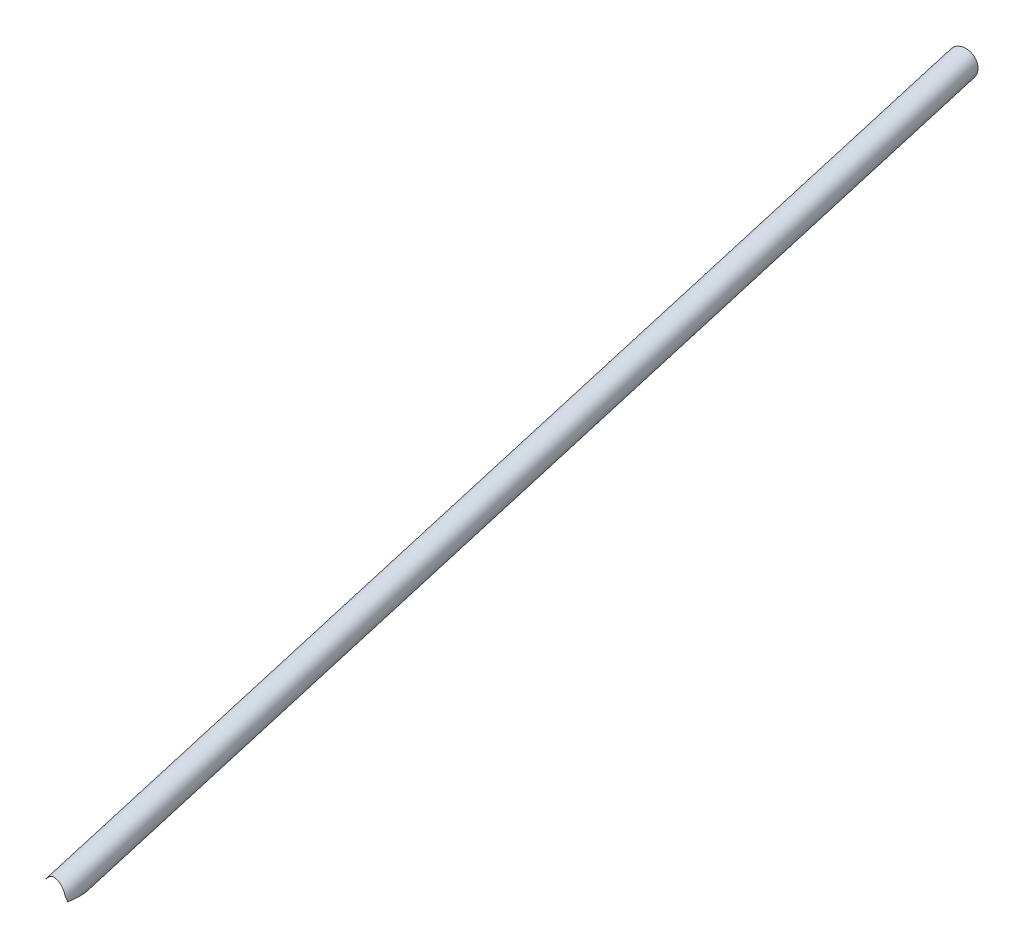
ISO-10303-21;
HEADER;
FILE_DESCRIPTION(('STEP AP214'),'2;1');
FILE_NAME('part.step','',(''),(''),'','','');
FILE_SCHEMA(('AUTOMOTIVE_DESIGN { 1 0 10303 214 1 1 1 1 }'));
ENDSEC;
DATA;
#1=APPLICATION_CONTEXT('core data for automotive mechanical design processes');
#2=APPLICATION_PROTOCOL_DEFINITION('international standard','automotive_design',2000,#1);
#3=PRODUCT_CONTEXT('',#1,'mechanical');
#4=PRODUCT('Part','Part','',(#3));
#5=PRODUCT_RELATED_PRODUCT_CATEGORY('part','',(#4));
#6=PRODUCT_DEFINITION_FORMATION('','',#4);
#7=PRODUCT_DEFINITION_CONTEXT('part definition',#1,'design');
#8=PRODUCT_DEFINITION('design','',#6,#7);
#9=PRODUCT_DEFINITION_SHAPE('','',#8);
#10=(LENGTH_UNIT() NAMED_UNIT(*) SI_UNIT(.MILLI.,.METRE.));
#11=(NAMED_UNIT(*) PLANE_ANGLE_UNIT() SI_UNIT($,.RADIAN.));
#12=(NAMED_UNIT(*) SI_UNIT($,.STERADIAN.) SOLID_ANGLE_UNIT());
#13=UNCERTAINTY_MEASURE_WITH_UNIT(LENGTH_MEASURE(1.E-05),#10,'distance_accuracy_value','');
#14=(GEOMETRIC_REPRESENTATION_CONTEXT(3) GLOBAL_UNCERTAINTY_ASSIGNED_CONTEXT((#13)) GLOBAL_UNIT_ASSIGNED_CONTEXT((#10,
#11,#12)) REPRESENTATION_CONTEXT('',''));
#15=CARTESIAN_POINT('',(0.,0.,0.));
#16=DIRECTION('',(0.,0.,1.));
#17=DIRECTION('',(1.,0.,0.));
#18=AXIS2_PLACEMENT_3D('',#15,#16,#17);
#19=CARTESIAN_POINT('',(-150.,500.,-1140.));
#20=DIRECTION('',(-0.0991899501072693,-0.396759800429077,0.912547540986877));
#21=DIRECTION('',(0.,-0.917070056253235,-0.39872611141445));
#22=AXIS2_PLACEMENT_3D('',#19,#20,#21);
#23=CYLINDRICAL_SURFACE('',#22,9.79999999999998);
#24=CARTESIAN_POINT('',(-150.,500.,-1140.));
#25=DIRECTION('',(-0.136924020573454,0.0230393226257372,-0.990313587810925));
#26=DIRECTION('',(-0.508281006832033,-0.859722512143853,0.0502754433782237));
#27=AXIS2_PLACEMENT_3D('',#24,#25,#26);
#28=ELLIPSE('',#27,10.89775457985,9.79999999999998);
#29=CARTESIAN_POINT('',(-155.539121670055,490.630955055884,-1139.45211055667));
#30=VERTEX_POINT('',#29);
#31=EDGE_CURVE('E103',#30,#30,#28,.T.);
#32=ORIENTED_EDGE('',*,*,#31,.T.);
#33=EDGE_LOOP('',(#32));
#34=FACE_BOUND('',#33,.T.);
#35=CARTESIAN_POINT('',(-220.0037526769,210.997702741119,-499.872991264384));
#36=CARTESIAN_POINT('',(-219.898541977434,210.83933172215,-499.508740659336));
#37=CARTESIAN_POINT('',(-219.797822306965,210.683385906516,-499.142129660316));
#38=CARTESIAN_POINT('',(-219.603918873193,210.375694236398,-498.405160474535));
#39=CARTESIAN_POINT('',(-219.510735682371,210.223948701549,-498.034802005509));
#40=CARTESIAN_POINT('',(-219.330804767801,209.924134834567,-497.290934981755));
#41=CARTESIAN_POINT('',(-219.244058699957,209.776067455086,-496.917425643818));
#42=CARTESIAN_POINT('',(-219.076189800758,209.48326963091,-496.167839782356));
#43=CARTESIAN_POINT('',(-218.995067131732,209.338539282624,-495.791763185067));
#44=CARTESIAN_POINT('',(-218.75895894337,208.90863598135,-494.659598100473));
#45=CARTESIAN_POINT('',(-218.611388850005,208.628013159537,-493.900229623437));
#46=CARTESIAN_POINT('',(-218.332013835661,208.077182915028,-492.374843704058));
#47=CARTESIAN_POINT('',(-218.200209786988,207.806976069189,-491.608825896333));
#48=CARTESIAN_POINT('',(-218.012075801151,207.408280938567,-490.454546374064));
#49=CARTESIAN_POINT('',(-217.95086852304,207.276276755357,-490.068281408356));
#50=CARTESIAN_POINT('',(-217.831464384232,207.014551797917,-489.294531384269));
#51=CARTESIAN_POINT('',(-217.773267408381,206.884830936469,-488.907046373164));
#52=CARTESIAN_POINT('',(-217.602803835464,206.498965771995,-487.742854714684));
#53=CARTESIAN_POINT('',(-217.494669606981,206.246129590103,-486.964442475506));
#54=CARTESIAN_POINT('',(-217.287828936704,205.749153504973,-485.404123514754));
#55=CARTESIAN_POINT('',(-217.18911700113,205.505008586913,-484.622219111202));
#56=CARTESIAN_POINT('',(-216.999696422368,205.025322653819,-483.054828887457));
#57=CARTESIAN_POINT('',(-216.908987636174,204.78978148509,-482.269343131521));
#58=CARTESIAN_POINT('',(-216.712489502068,204.26975776419,-480.497619596009));
#59=CARTESIAN_POINT('',(-216.608620944944,203.987810385815,-479.510423963666));
#60=CARTESIAN_POINT('',(-216.409355114824,203.439600545711,-477.530672991248));
#61=CARTESIAN_POINT('',(-216.31395901938,203.173340265991,-476.538116926421));
#62=CARTESIAN_POINT('',(-216.175630909405,202.788431802316,-475.045950974128));
#63=CARTESIAN_POINT('',(-216.13034938621,202.662635245507,-474.548396882427));
#64=CARTESIAN_POINT('',(-216.041038146166,202.416441376279,-473.551844740876));
#65=CARTESIAN_POINT('',(-215.997008415411,202.296044003872,-473.052846707135));
#66=CARTESIAN_POINT('',(-215.909872155996,202.06149581362,-472.053368215613));
#67=CARTESIAN_POINT('',(-215.866765510192,201.947344200256,-471.552887955222));
#68=CARTESIAN_POINT('',(-215.781094603804,201.726416168036,-470.550262226481));
#69=CARTESIAN_POINT('',(-215.738530331388,201.619639588038,-470.048116794765));
#70=CARTESIAN_POINT('',(-215.650428529746,201.407582320787,-469.005448483552));
#71=CARTESIAN_POINT('',(-215.604899578271,201.302973506736,-468.464787059967));
#72=CARTESIAN_POINT('',(-215.513365264216,201.106745651468,-467.381061835205));
#73=CARTESIAN_POINT('',(-215.467359841117,201.015128282607,-466.837997734));
#74=CARTESIAN_POINT('',(-215.37415119422,200.848785929421,-465.748745415167));
#75=CARTESIAN_POINT('',(-215.326946806406,200.77407811791,-465.202554594021));
#76=CARTESIAN_POINT('',(-215.2547857882,200.679403455488,-464.381433318247));
#77=CARTESIAN_POINT('',(-215.230508633869,200.650744883853,-464.107445258742));
#78=CARTESIAN_POINT('',(-215.181439281758,200.600309499969,-463.558889114116));
#79=CARTESIAN_POINT('',(-215.156647111881,200.57853231591,-463.28432106114));
#80=CARTESIAN_POINT('',(-215.100426615081,200.53885347249,-462.667972170555));
#81=CARTESIAN_POINT('',(-215.068848267619,200.523175777996,-462.326054620453));
#82=CARTESIAN_POINT('',(-215.004924025603,200.507662753279,-461.641956865593));
#83=CARTESIAN_POINT('',(-214.972578317376,200.507823615818,-461.299776743728));
#84=CARTESIAN_POINT('',(-214.907544676726,200.528179233874,-460.616449264774));
#85=CARTESIAN_POINT('',(-214.874857284927,200.548346029101,-460.27530113282));
#86=CARTESIAN_POINT('',(-214.81005741036,200.613999431036,-459.595377249243));
#87=CARTESIAN_POINT('',(-214.7779446224,200.659472158429,-459.256600300161));
#88=CARTESIAN_POINT('',(-214.727071530788,200.760571780086,-458.701801429869));
#89=CARTESIAN_POINT('',(-214.707562303326,200.807117524649,-458.484197905931));
#90=CARTESIAN_POINT('',(-214.670565152225,200.915307841983,-458.05263088851));
#91=CARTESIAN_POINT('',(-214.653076462255,200.976946662548,-457.838666041418));
#92=CARTESIAN_POINT('',(-214.621365610673,201.11669597458,-457.416333187158));
#93=CARTESIAN_POINT('',(-214.607137357502,201.194775217274,-457.207955395758));
#94=CARTESIAN_POINT('',(-214.58345522324,201.368405637347,-456.798291988106));
#95=CARTESIAN_POINT('',(-214.574001059559,201.463955780124,-456.597005952732));
#96=CARTESIAN_POINT('',(-214.561589632928,201.673665076132,-456.201472785184));
#97=CARTESIAN_POINT('',(-214.558699908899,201.788004814546,-456.007318869976));
#98=CARTESIAN_POINT('',(-214.561524930687,202.03356840442,-455.630047733012));
#99=CARTESIAN_POINT('',(-214.567239849397,202.164792595088,-455.446930733097));
#100=CARTESIAN_POINT('',(-214.589038425511,202.442248108915,-455.092800052293));
#101=CARTESIAN_POINT('',(-214.605133302664,202.588495526774,-454.921799690582));
#102=CARTESIAN_POINT('',(-214.649131281722,202.893178122741,-454.592685665046));
#103=CARTESIAN_POINT('',(-214.677034448436,203.051613367741,-454.434572071958));
#104=CARTESIAN_POINT('',(-214.741696873717,203.358852109674,-454.148701514513));
#105=CARTESIAN_POINT('',(-214.777062600126,203.506657294005,-454.019546998449));
#106=CARTESIAN_POINT('',(-214.858266387495,203.807427209433,-453.770954805609));
#107=CARTESIAN_POINT('',(-214.904103287638,203.960391367015,-453.651516053749));
#108=CARTESIAN_POINT('',(-215.006502909779,204.269621983415,-453.421848052287));
#109=CARTESIAN_POINT('',(-215.063067064095,204.425888880742,-453.31162003535));
#110=CARTESIAN_POINT('',(-215.187000218061,204.740017747765,-453.099836371536));
#111=CARTESIAN_POINT('',(-215.254370585218,204.897879916968,-452.998281824767));
#112=CARTESIAN_POINT('',(-215.410973468012,205.237778930944,-452.788434445977));
#113=CARTESIAN_POINT('',(-215.501973311572,205.419828702529,-452.681478258533));
#114=CARTESIAN_POINT('',(-215.698021057617,205.781989035189,-452.477638743009));
#115=CARTESIAN_POINT('',(-215.803069944461,205.962099459425,-452.38075612159));
#116=CARTESIAN_POINT('',(-216.026874456738,206.318688506442,-452.196401839405));
#117=CARTESIAN_POINT('',(-216.145635189476,206.49516574693,-452.108933708882));
#118=CARTESIAN_POINT('',(-216.396341051081,206.842890826029,-451.9429450064));
#119=CARTESIAN_POINT('',(-216.528287079579,207.014138306773,-451.864425045755));
#120=CARTESIAN_POINT('',(-216.823287871307,207.372537749894,-451.706016630946));
#121=CARTESIAN_POINT('',(-216.988142842892,207.558752094642,-451.627350698705));
#122=CARTESIAN_POINT('',(-217.333077101251,207.921006095912,-451.480655832299));
#123=CARTESIAN_POINT('',(-217.513157653607,208.097044904572,-451.41262778372));
#124=CARTESIAN_POINT('',(-217.887489216179,208.437499419234,-451.286983323167));
#125=CARTESIAN_POINT('',(-218.081744245318,208.601911802546,-451.229369880297));
#126=CARTESIAN_POINT('',(-218.483163424881,208.917767107984,-451.124512507122));
#127=CARTESIAN_POINT('',(-218.690327619436,209.069209985768,-451.077268612269));
#128=CARTESIAN_POINT('',(-219.125159273858,209.364066538698,-450.991455288807));
#129=CARTESIAN_POINT('',(-219.35332173178,209.506880458773,-450.953330710893));
#130=CARTESIAN_POINT('',(-219.820643641494,209.776211513944,-450.8886138399));
#131=CARTESIAN_POINT('',(-220.059803474357,209.902728083739,-450.862021946776));
#132=CARTESIAN_POINT('',(-220.547411495375,210.138647935161,-450.820723289283));
#133=CARTESIAN_POINT('',(-220.795859678403,210.248051226234,-450.806016518353));
#134=CARTESIAN_POINT('',(-221.300232237199,210.449155251392,-450.788985464775));
#135=CARTESIAN_POINT('',(-221.556156568962,210.540856089649,-450.786661109259));
#136=CARTESIAN_POINT('',(-222.074701477308,210.706571175633,-450.795069982975));
#137=CARTESIAN_POINT('',(-222.337346502075,210.780506078992,-450.805860532392));
#138=CARTESIAN_POINT('',(-222.866186233639,210.91008358533,-450.841445984494));
#139=CARTESIAN_POINT('',(-223.132380996319,210.965725899977,-450.866241107905));
#140=CARTESIAN_POINT('',(-223.666287945453,211.058968199897,-450.930920928675));
#141=CARTESIAN_POINT('',(-223.934001022146,211.096556179992,-450.970815635026));
#142=CARTESIAN_POINT('',(-224.468377251314,211.154214150952,-451.067001026808));
#143=CARTESIAN_POINT('',(-224.735040426954,211.174284530519,-451.123291348396));
#144=CARTESIAN_POINT('',(-225.259260727881,211.197684754343,-451.252492946122));
#145=CARTESIAN_POINT('',(-225.516892435512,211.201349575265,-451.325039562838));
#146=CARTESIAN_POINT('',(-226.025905243115,211.194311353536,-451.489054791647));
#147=CARTESIAN_POINT('',(-226.277286170338,211.183607914248,-451.580523926038));
#148=CARTESIAN_POINT('',(-226.770257050517,211.149934552156,-451.783983272675));
#149=CARTESIAN_POINT('',(-227.011864016665,211.126987026264,-451.895935771791));
#150=CARTESIAN_POINT('',(-227.482333899541,211.071610045153,-452.14209527429));
#151=CARTESIAN_POINT('',(-227.711199661572,211.039182717111,-452.276297282173));
#152=CARTESIAN_POINT('',(-228.126972263523,210.972457623113,-452.551030458013));
#153=CARTESIAN_POINT('',(-228.315665333328,210.938814337702,-452.689016964331));
#154=CARTESIAN_POINT('',(-228.677945944206,210.869610277575,-452.983131112375));
#155=CARTESIAN_POINT('',(-228.851536340987,210.83404986743,-453.139255311418));
#156=CARTESIAN_POINT('',(-229.181523710596,210.763860948942,-453.468453691624));
#157=CARTESIAN_POINT('',(-229.337945054015,210.729231173789,-453.641503170238));
#158=CARTESIAN_POINT('',(-229.632869838212,210.663331258692,-454.002830736472));
#159=CARTESIAN_POINT('',(-229.771371616703,210.632061430475,-454.191110234257));
#160=CARTESIAN_POINT('',(-230.037057004416,210.573278552184,-454.590224589374));
#161=CARTESIAN_POINT('',(-230.163305150012,210.546037882926,-454.8017197896));
#162=CARTESIAN_POINT('',(-230.397165668695,210.498542655979,-455.235470806513));
#163=CARTESIAN_POINT('',(-230.504775122009,210.478289192352,-455.45772830216));
#164=CARTESIAN_POINT('',(-230.703534245723,210.445092664141,-455.910688453243));
#165=CARTESIAN_POINT('',(-230.794636498104,210.432170439319,-456.141413217917));
#166=CARTESIAN_POINT('',(-230.9622265321,210.413490446598,-456.608310251851));
#167=CARTESIAN_POINT('',(-231.038714914962,210.407732383897,-456.844482296552));
#168=CARTESIAN_POINT('',(-231.200042386977,210.402083011359,-457.390782723299));
#169=CARTESIAN_POINT('',(-231.280682327612,210.404425051732,-457.702164317566));
#170=CARTESIAN_POINT('',(-231.425381645654,210.418614244467,-458.328605523965));
#171=CARTESIAN_POINT('',(-231.489432050429,210.430466526407,-458.643667030548));
#172=CARTESIAN_POINT('',(-231.604385230104,210.462152195899,-459.276382232837));
#173=CARTESIAN_POINT('',(-231.655261526537,210.482001455047,-459.594039845412));
#174=CARTESIAN_POINT('',(-231.746314780964,210.528290489007,-460.230312019371));
#175=CARTESIAN_POINT('',(-231.786493630507,210.554729097073,-460.548926401487));
#176=CARTESIAN_POINT('',(-231.858478854799,210.613282145645,-461.18937646374));
#177=CARTESIAN_POINT('',(-231.890209676845,210.645443775548,-461.511216137065));
#178=CARTESIAN_POINT('',(-231.946404783734,210.714297605412,-462.155041353136));
#179=CARTESIAN_POINT('',(-231.970868827305,210.750989955744,-462.477026900369));
#180=CARTESIAN_POINT('',(-232.013697130245,210.828044286263,-463.120506455635));
#181=CARTESIAN_POINT('',(-232.032069692181,210.868401175327,-463.442000533273));
#182=CARTESIAN_POINT('',(-232.063678203373,210.952169617679,-464.08482645134));
#183=CARTESIAN_POINT('',(-232.076914313486,210.995581075257,-464.406158296536));
#184=CARTESIAN_POINT('',(-232.100279790145,211.090233358092,-465.086836107085));
#185=CARTESIAN_POINT('',(-232.109852239054,211.141791216956,-465.446156733193));
#186=CARTESIAN_POINT('',(-232.124233831614,211.247443950452,-466.164522695637));
#187=CARTESIAN_POINT('',(-232.129042864222,211.301538884197,-466.52356802536));
#188=CARTESIAN_POINT('',(-232.137250580971,211.466865138228,-467.600357577464));
#189=CARTESIAN_POINT('',(-232.134427747317,211.581128018665,-468.31768572416));
#190=CARTESIAN_POINT('',(-232.115494159042,211.8147442572,-469.751625281926));
#191=CARTESIAN_POINT('',(-232.099377574059,211.934099827061,-470.468236240357));
#192=CARTESIAN_POINT('',(-232.055820505066,212.175750332153,-471.900626537555));
#193=CARTESIAN_POINT('',(-232.028379783725,212.298045328937,-472.616405858577));
#194=CARTESIAN_POINT('',(-231.963297546459,212.544371522659,-474.049479380964));
#195=CARTESIAN_POINT('',(-231.925624741522,212.668406919757,-474.766771420107));
#196=CARTESIAN_POINT('',(-231.840825902121,212.916598853625,-476.200782829872));
#197=CARTESIAN_POINT('',(-231.793699748447,213.040755391902,-476.917502193157));
#198=CARTESIAN_POINT('',(-231.690354009519,213.288110554682,-478.350176302893));
#199=CARTESIAN_POINT('',(-231.634137785451,213.411309515681,-479.066131233881));
#200=CARTESIAN_POINT('',(-231.512648950929,213.655886560805,-480.497580279977));
#201=CARTESIAN_POINT('',(-231.447376394702,213.777264655828,-481.21307439782));
#202=CARTESIAN_POINT('',(-231.30807569797,214.016475285748,-482.63843319418));
#203=CARTESIAN_POINT('',(-231.234114333517,214.13432712155,-483.34830114281));
#204=CARTESIAN_POINT('',(-231.076619775329,214.366546864893,-484.767555696608));
#205=CARTESIAN_POINT('',(-230.993086493104,214.480914740213,-485.476942297266));
#206=CARTESIAN_POINT('',(-230.815689643579,214.705314540271,-486.895533861273));
#207=CARTESIAN_POINT('',(-230.721820251849,214.815343972368,-487.604738494149));
#208=CARTESIAN_POINT('',(-230.52275784438,215.029940419548,-489.022375061863));
#209=CARTESIAN_POINT('',(-230.417565112561,215.134507571493,-489.730807015624));
#210=CARTESIAN_POINT('',(-230.194788512269,215.33653324915,-491.144121942385));
#211=CARTESIAN_POINT('',(-230.077249996464,215.434015711303,-491.849008581912));
#212=CARTESIAN_POINT('',(-229.827423627649,215.620609944659,-493.257254991623));
#213=CARTESIAN_POINT('',(-229.695136501489,215.709722127974,-493.960614835311));
#214=CARTESIAN_POINT('',(-229.412968191604,215.877242982556,-495.364525164764));
#215=CARTESIAN_POINT('',(-229.26310193355,215.95566061348,-496.065077518963));
#216=CARTESIAN_POINT('',(-229.02162469425,216.062720792209,-497.113056610122));
#217=CARTESIAN_POINT('',(-228.938361671076,216.096643649656,-497.46187381293));
#218=CARTESIAN_POINT('',(-228.765438139836,216.160346303889,-498.158293354028));
#219=CARTESIAN_POINT('',(-228.675778005302,216.190126342279,-498.505895762011));
#220=CARTESIAN_POINT('',(-228.535761298941,216.231078283448,-499.025863493769));
#221=CARTESIAN_POINT('',(-228.488199719857,216.244102198706,-499.198838097205));
#222=CARTESIAN_POINT('',(-228.391048157127,216.268791607211,-499.544318006423));
#223=CARTESIAN_POINT('',(-228.341458121406,216.280457065552,-499.716823300035));
#224=CARTESIAN_POINT('',(-228.189343935872,216.313216603435,-500.233622150125));
#225=CARTESIAN_POINT('',(-228.083502380677,216.332065828572,-500.577098771919));
#226=CARTESIAN_POINT('',(-227.86139252782,216.362246606318,-501.259873477635));
#227=CARTESIAN_POINT('',(-227.745156701867,216.37360070218,-501.599181051447));
#228=CARTESIAN_POINT('',(-227.499284555795,216.386726897463,-502.27304442494));
#229=CARTESIAN_POINT('',(-227.369653858241,216.388503000776,-502.607602151857));
#230=CARTESIAN_POINT('',(-227.119006734499,216.37995830622,-503.206537132011));
#231=CARTESIAN_POINT('',(-227.001011876305,216.371865781095,-503.472201068109));
#232=CARTESIAN_POINT('',(-226.749570166614,216.344230598519,-503.996922802397));
#233=CARTESIAN_POINT('',(-226.6160706634,216.324647952916,-504.255954215937));
#234=CARTESIAN_POINT('',(-226.399738457707,216.282922606971,-504.636072191996));
#235=CARTESIAN_POINT('',(-226.32444673946,216.266821205251,-504.762102576402));
#236=CARTESIAN_POINT('',(-226.167626872576,216.229494890221,-505.009601371631));
#237=CARTESIAN_POINT('',(-226.086095101298,216.208266985088,-505.131067070495));
#238=CARTESIAN_POINT('',(-225.916159748721,216.159628137315,-505.366876536654));
#239=CARTESIAN_POINT('',(-225.827794655418,216.132250376455,-505.481254470013));
#240=CARTESIAN_POINT('',(-225.642659657127,216.069744988734,-505.700593790161));
#241=CARTESIAN_POINT('',(-225.545903759015,216.03463013205,-505.805570297188));
#242=CARTESIAN_POINT('',(-225.359859813046,215.96149699191,-505.985313809904));
#243=CARTESIAN_POINT('',(-225.272056422965,215.924962505646,-506.062191443413));
#244=CARTESIAN_POINT('',(-225.08957868822,215.844162948706,-506.202798126629));
#245=CARTESIAN_POINT('',(-224.994907130301,215.799901003292,-506.266532469314));
#246=CARTESIAN_POINT('',(-224.798302833459,215.70241331437,-506.376999432064));
#247=CARTESIAN_POINT('',(-224.696294688426,215.64908334687,-506.423511717696));
#248=CARTESIAN_POINT('',(-224.488970061183,215.534528759077,-506.493824091893));
#249=CARTESIAN_POINT('',(-224.383659013719,215.473316640886,-506.517659656903));
#250=CARTESIAN_POINT('',(-224.185910894186,215.352556245407,-506.53955799833));
#251=CARTESIAN_POINT('',(-224.093379687609,215.293619174768,-506.540257969669));
#252=CARTESIAN_POINT('',(-223.911577883151,215.173268283006,-506.523741806032));
#253=CARTESIAN_POINT('',(-223.822310895209,215.111851868942,-506.506506421545));
#254=CARTESIAN_POINT('',(-223.615967973326,214.964989545821,-506.44741694347));
#255=CARTESIAN_POINT('',(-223.501117801783,214.879226156302,-506.398724693955));
#256=CARTESIAN_POINT('',(-223.281822723414,214.709006024823,-506.280315766423));
#257=CARTESIAN_POINT('',(-223.177404294864,214.624553045596,-506.210547310091));
#258=CARTESIAN_POINT('',(-222.986110895228,214.464668088425,-506.062365010378));
#259=CARTESIAN_POINT('',(-222.898501552761,214.389050998633,-505.98507174059));
#260=CARTESIAN_POINT('',(-222.730305176273,214.239963180661,-505.821229234793));
#261=CARTESIAN_POINT('',(-222.649724764889,214.166494519127,-505.734671437151));
#262=CARTESIAN_POINT('',(-222.494405031075,214.02149090629,-505.554419714279));
#263=CARTESIAN_POINT('',(-222.419683187041,213.94996212885,-505.460705967903));
#264=CARTESIAN_POINT('',(-222.275473867362,213.808927981042,-505.2680107642));
#265=CARTESIAN_POINT('',(-222.205984195118,213.739421769152,-505.169031547571));
#266=CARTESIAN_POINT('',(-222.026473494486,213.556348360857,-504.899370961096));
#267=CARTESIAN_POINT('',(-221.920403177731,213.444380278478,-504.724979938697));
#268=CARTESIAN_POINT('',(-221.717944793574,213.224628112617,-504.36807325296));
#269=CARTESIAN_POINT('',(-221.621562593557,213.116846588582,-504.185552761602));
#270=CARTESIAN_POINT('',(-221.436505323574,212.904674779575,-503.814208847658));
#271=CARTESIAN_POINT('',(-221.347845299672,212.800291352745,-503.625374070493));
#272=CARTESIAN_POINT('',(-221.177055568364,212.594603060266,-503.243110224738));
#273=CARTESIAN_POINT('',(-221.094926974234,212.493298721253,-503.04968038019));
#274=CARTESIAN_POINT('',(-220.936052363223,212.293207868386,-502.658884755063));
#275=CARTESIAN_POINT('',(-220.859315684584,212.194425902589,-502.46151287108));
#276=CARTESIAN_POINT('',(-220.710586953133,211.999228865273,-502.063826833434));
#277=CARTESIAN_POINT('',(-220.638595258202,211.902813972629,-501.863512459229));
#278=CARTESIAN_POINT('',(-220.428929569767,211.616923043414,-501.259391180244));
#279=CARTESIAN_POINT('',(-220.297387652452,211.430574844236,-500.851959783799));
#280=CARTESIAN_POINT('',(-220.143494191009,211.205617735645,-500.346748653704));
#281=CARTESIAN_POINT('',(-220.115079842885,211.163769087755,-500.252180055558));
#282=CARTESIAN_POINT('',(-220.058926532434,211.080459804676,-500.06279132674));
#283=CARTESIAN_POINT('',(-220.031186924664,211.038998824075,-499.967971541082));
#284=CARTESIAN_POINT('',(-220.0037526769,210.997702741119,-499.872991264384));
#285=B_SPLINE_CURVE_WITH_KNOTS('',3,(#35,#36,#37,#38,#39,#40,#41,#42,#43,#44,#45,#46,#47,#48,
#49,#50,#51,#52,#53,#54,#55,#56,#57,#58,#59,#60,#61,#62,#63,#64,#65,#66,#67,#68,#69,#70,#71,#72,
#73,#74,#75,#76,#77,#78,#79,#80,#81,#82,#83,#84,#85,#86,#87,#88,#89,#90,#91,#92,#93,#94,#95,#96,
#97,#98,#99,#100,#101,#102,#103,#104,#105,#106,#107,#108,#109,#110,#111,#112,#113,#114,#115,
#116,#117,#118,#119,#120,#121,#122,#123,#124,#125,#126,#127,#128,#129,#130,#131,#132,#133,#134,
#135,#136,#137,#138,#139,#140,#141,#142,#143,#144,#145,#146,#147,#148,#149,#150,#151,#152,#153,
#154,#155,#156,#157,#158,#159,#160,#161,#162,#163,#164,#165,#166,#167,#168,#169,#170,#171,#172,
#173,#174,#175,#176,#177,#178,#179,#180,#181,#182,#183,#184,#185,#186,#187,#188,#189,#190,#191,
#192,#193,#194,#195,#196,#197,#198,#199,#200,#201,#202,#203,#204,#205,#206,#207,#208,#209,#210,
#211,#212,#213,#214,#215,#216,#217,#218,#219,#220,#221,#222,#223,#224,#225,#226,#227,#228,#229,
#230,#231,#232,#233,#234,#235,#236,#237,#238,#239,#240,#241,#242,#243,#244,#245,#246,#247,#248,
#249,#250,#251,#252,#253,#254,#255,#256,#257,#258,#259,#260,#261,#262,#263,#264,#265,#266,#267,
#268,#269,#270,#271,#272,#273,#274,#275,#276,#277,#278,#279,#280,#281,#282,#283,#284),
.UNSPECIFIED.,.T.,.F.,(4,2,2,2,2,2,2,2,2,2,2,2,2,2,2,2,2,2,2,2,2,2,2,2,2,2,2,2,2,2,2,2,2,2,2,2,
2,2,2,2,2,2,2,2,2,2,2,2,2,2,2,2,2,2,2,2,2,2,2,2,2,2,2,2,2,2,2,2,2,2,2,2,2,2,2,2,2,2,2,2,2,2,2,2,
2,2,2,2,2,2,2,2,2,2,2,2,2,2,2,2,2,2,2,2,2,2,2,2,2,2,2,2,2,2,2,2,2,2,2,2,2,2,2,2,4),(0.,
1.23265464315552,2.46540283257261,3.6984670460467,4.93156683890578,7.39993393767297,
9.86843754353147,11.1067054894791,12.3449260324296,14.8214667248068,17.296554505456,
19.7715980504053,22.8671672466259,25.9631660117774,27.5087531800353,29.0543231718507,
30.5996958449188,32.1450347416803,33.8026086556646,35.4603957515296,37.1198589641673,
37.9494404649946,38.7789771347735,39.8098783694467,40.8405317989104,41.8697468137174,
42.8983978998184,43.5680811424742,44.237509554636,44.9056768694551,45.5738046291652,
46.2487759460415,46.9237608251964,47.5994765243769,48.2751959323347,48.8729396080117,
49.4706170510225,50.0683743530265,50.6662073599193,51.355270436594,52.0443818184306,
52.7337507093664,53.4231666679984,54.2048239363326,54.9865462415962,55.7684910580783,
56.5504385478293,57.3650535763004,58.1796968534331,58.9943396808317,59.808977714195,
60.6271890554228,61.4454132927815,62.2641808553215,63.0829302496056,63.8848834368959,
64.6868587626165,65.4873721171664,66.2877059818324,66.995101679387,67.7023633260793,
68.4086077015381,69.1149175440354,69.857193478514,70.5995855864008,71.3440775765591,
72.0885389301063,73.0527419497849,74.0174653853181,74.9841130139326,75.9505896039881,
76.9254394872414,77.9003217337692,78.8738697198426,79.847387214998,80.9367188413948,
82.0260758613617,84.2050009429758,86.3848821640317,88.5648090730189,90.7514785978745,
92.9381756995186,95.1240660795061,97.3099433715225,99.4800029812262,101.650082654067,
103.821391493228,105.992645902095,108.156186004803,110.319619529632,112.481229295717,
113.561821099171,114.642349857505,115.181933926688,115.721531857289,116.801038746713,
117.877283805648,118.953078926475,119.8250400381,120.700053918388,121.142900374556,
121.586005902758,122.026775738439,122.46682345587,122.832795422163,123.198619717656,
123.568974589575,123.938749104867,124.26620808432,124.594018879103,125.045599244032,
125.498298163929,125.915184102957,126.332458680904,126.75093419516,127.1692330316,
127.867096958692,128.565381016273,129.264996533679,129.964731045354,130.665648988299,
131.366619736184,132.766970498888,133.088712680428,133.41013391476),.UNSPECIFIED.);
#286=CARTESIAN_POINT('',(-227.66057539334,211.045111244531,-452.251060542697));
#287=VERTEX_POINT('',#286);
#288=CARTESIAN_POINT('',(-215.417930816631,200.926928641914,-466.260367661846));
#289=VERTEX_POINT('',#288);
#290=EDGE_CURVE('E98',#287,#289,#285,.T.);
#291=ORIENTED_EDGE('',*,*,#290,.T.);
#292=CARTESIAN_POINT('',(-222.839154654504,199.656094830705,-473.787293070432));
#293=CARTESIAN_POINT('',(-222.688053234654,199.66665120872,-473.81157494525));
#294=CARTESIAN_POINT('',(-222.53589017786,199.677848045147,-473.828934059664));
#295=CARTESIAN_POINT('',(-222.230682760392,199.7014880811,-473.848789976039));
#296=CARTESIAN_POINT('',(-222.077638548268,199.713931076024,-473.851289213725));
#297=CARTESIAN_POINT('',(-221.772326770698,199.739967995226,-473.840794230393));
#298=CARTESIAN_POINT('',(-221.620058569954,199.753560726661,-473.827815888434));
#299=CARTESIAN_POINT('',(-221.317752598665,199.781780429542,-473.786281904019));
#300=CARTESIAN_POINT('',(-221.167714883852,199.796407426778,-473.757725873006));
#301=CARTESIAN_POINT('',(-220.871729819852,199.826502842202,-473.685562630919));
#302=CARTESIAN_POINT('',(-220.725774761255,199.84196948575,-473.641986197146));
#303=CARTESIAN_POINT('',(-220.438949150531,199.873595740319,-473.540716452023));
#304=CARTESIAN_POINT('',(-220.29807869192,199.889755364074,-473.483022881182));
#305=CARTESIAN_POINT('',(-220.02220104299,199.922620651635,-473.354711584157));
#306=CARTESIAN_POINT('',(-219.887202201708,199.939327037357,-473.284076154047));
#307=CARTESIAN_POINT('',(-219.623841999576,199.97311751767,-473.131386615392));
#308=CARTESIAN_POINT('',(-219.495484837519,199.990201841681,-473.049325401705));
#309=CARTESIAN_POINT('',(-219.055917280597,200.050783959874,-472.742923048558));
#310=CARTESIAN_POINT('',(-218.763101249845,200.094986313544,-472.491794303484));
#311=CARTESIAN_POINT('',(-218.356661869154,200.161442489946,-472.083875035255));
#312=CARTESIAN_POINT('',(-218.226514729672,200.18364575405,-471.942515982277));
#313=CARTESIAN_POINT('',(-217.976274044781,200.228073447553,-471.651106550468));
#314=CARTESIAN_POINT('',(-217.856179605413,200.250297874891,-471.501056946477));
#315=CARTESIAN_POINT('',(-217.540003505004,200.311159911571,-471.080299226768));
#316=CARTESIAN_POINT('',(-217.35343415082,200.349776558039,-470.802450181925));
#317=CARTESIAN_POINT('',(-217.004946050582,200.426938092842,-470.231650328305));
#318=CARTESIAN_POINT('',(-216.84304661536,200.465482901871,-469.93868792693));
#319=CARTESIAN_POINT('',(-216.540329787548,200.542707287572,-469.341141365165));
#320=CARTESIAN_POINT('',(-216.399571976762,200.581386942005,-469.036527286624));
#321=CARTESIAN_POINT('',(-216.136981068397,200.658959148351,-468.419437979941));
#322=CARTESIAN_POINT('',(-216.015143439987,200.697851646976,-468.106964654751));
#323=CARTESIAN_POINT('',(-215.786046533799,200.776830458293,-467.470312800744));
#324=CARTESIAN_POINT('',(-215.679096992713,200.816925566653,-467.146024684544));
#325=CARTESIAN_POINT('',(-215.480594783948,200.897932727694,-466.492829194018));
#326=CARTESIAN_POINT('',(-215.389045312552,200.938844947999,-466.163920876081));
#327=CARTESIAN_POINT('',(-215.219794255664,201.021901002604,-465.502382672916));
#328=CARTESIAN_POINT('',(-215.142106489437,201.064046017754,-465.169749421295));
#329=CARTESIAN_POINT('',(-214.999510607978,201.149989536995,-464.50200683687));
#330=CARTESIAN_POINT('',(-214.934601571035,201.193787921558,-464.166897684461));
#331=CARTESIAN_POINT('',(-214.816635223532,201.283611986279,-463.494927797963));
#332=CARTESIAN_POINT('',(-214.763577171825,201.329637526933,-463.158067174759));
#333=CARTESIAN_POINT('',(-214.668608232124,201.424646170894,-462.483182406028));
#334=CARTESIAN_POINT('',(-214.626697847062,201.473629407516,-462.145158208701));
#335=CARTESIAN_POINT('',(-214.553570756425,201.57545397145,-461.468796573997));
#336=CARTESIAN_POINT('',(-214.522346095086,201.628292392774,-461.130459558535));
#337=CARTESIAN_POINT('',(-214.470284128398,201.739095183514,-460.453852125001));
#338=CARTESIAN_POINT('',(-214.449445782066,201.797059038541,-460.115581703653));
#339=CARTESIAN_POINT('',(-214.42001980113,201.912449854993,-459.480308218855));
#340=CARTESIAN_POINT('',(-214.410262881506,201.969107906601,-459.183220161456));
#341=CARTESIAN_POINT('',(-214.398983909241,202.089280686453,-458.590234432574));
#342=CARTESIAN_POINT('',(-214.397462432459,202.152795893863,-458.29433684578));
#343=CARTESIAN_POINT('',(-214.403117627635,202.288779011453,-457.704716904437));
#344=CARTESIAN_POINT('',(-214.410292806426,202.36124538285,-457.410994185186));
#345=CARTESIAN_POINT('',(-214.434172825972,202.518000554634,-456.827100484378));
#346=CARTESIAN_POINT('',(-214.450875332508,202.602286455393,-456.536928650626));
#347=CARTESIAN_POINT('',(-214.488604178815,202.759109475122,-456.048142153458));
#348=CARTESIAN_POINT('',(-214.506854093141,202.82765020434,-455.848038533289));
#349=CARTESIAN_POINT('',(-214.549467706695,202.974221902276,-455.45191509897));
#350=CARTESIAN_POINT('',(-214.573832234622,203.052254156618,-455.255895842266));
#351=CARTESIAN_POINT('',(-214.629550787261,203.219552592542,-454.870201852566));
#352=CARTESIAN_POINT('',(-214.66088893515,203.308793058506,-454.680513815881));
#353=CARTESIAN_POINT('',(-214.731755255968,203.500636657678,-454.309596637649));
#354=CARTESIAN_POINT('',(-214.771279120733,203.603232751275,-454.1283631077));
#355=CARTESIAN_POINT('',(-214.846910824206,203.791246511631,-453.828853205442));
#356=CARTESIAN_POINT('',(-214.880648880853,203.872938395459,-453.707640150533));
#357=CARTESIAN_POINT('',(-214.95335074942,204.044067289575,-453.472485719704));
#358=CARTESIAN_POINT('',(-214.992312752683,204.133501615462,-453.358541847079));
#359=CARTESIAN_POINT('',(-215.075788906288,204.319847373062,-453.139420087949));
#360=CARTESIAN_POINT('',(-215.120294295329,204.416746915825,-453.034228796191));
#361=CARTESIAN_POINT('',(-215.215156283059,204.617514974946,-452.833570176845));
#362=CARTESIAN_POINT('',(-215.265512863338,204.721383469376,-452.738102818665));
#363=CARTESIAN_POINT('',(-215.372214063103,204.935104614363,-452.557565100836));
#364=CARTESIAN_POINT('',(-215.428564277366,205.044962808576,-452.47250461759));
#365=CARTESIAN_POINT('',(-215.547148140985,205.269181401608,-452.313120449503));
#366=CARTESIAN_POINT('',(-215.609381954995,205.383541926375,-452.23879706529));
#367=CARTESIAN_POINT('',(-215.73969277045,205.615504737041,-452.10047628856));
#368=CARTESIAN_POINT('',(-215.807781420694,205.733113154097,-452.036500246959));
#369=CARTESIAN_POINT('',(-215.949481566353,205.969948512771,-451.918382481507));
#370=CARTESIAN_POINT('',(-216.023094830003,206.089175962496,-451.864243925418));
#371=CARTESIAN_POINT('',(-216.209371390525,206.380837217757,-451.742951031265));
#372=CARTESIAN_POINT('',(-216.324897856151,206.553464277374,-451.680641265062));
#373=CARTESIAN_POINT('',(-216.566324520059,206.896420049576,-451.571803606951));
#374=CARTESIAN_POINT('',(-216.692229396141,207.066747685058,-451.525282880422));
#375=CARTESIAN_POINT('',(-216.954108119893,207.403167005542,-451.44527139132));
#376=CARTESIAN_POINT('',(-217.0901011444,207.569249771975,-451.411806243172));
#377=CARTESIAN_POINT('',(-217.371459497356,207.895133207487,-451.355753449857));
#378=CARTESIAN_POINT('',(-217.516824527631,208.054934076166,-451.333165458824));
#379=CARTESIAN_POINT('',(-217.860598986922,208.412836708275,-451.291672022758));
#380=CARTESIAN_POINT('',(-218.062040404673,208.608389317408,-451.275800768624));
#381=CARTESIAN_POINT('',(-218.479054182095,208.984498349154,-451.256001090511));
#382=CARTESIAN_POINT('',(-218.694629886782,209.165051198842,-451.252075504089));
#383=CARTESIAN_POINT('',(-219.138813661838,209.509126193357,-451.25384584607));
#384=CARTESIAN_POINT('',(-219.36741710143,209.672654331998,-451.259538376024));
#385=CARTESIAN_POINT('',(-219.836571227174,209.981009028401,-451.278762552665));
#386=CARTESIAN_POINT('',(-220.077120958164,210.125837078002,-451.292293573547));
#387=CARTESIAN_POINT('',(-220.569632334586,210.395656778586,-451.325861896937));
#388=CARTESIAN_POINT('',(-220.821626495595,210.520586691803,-451.345918883467));
#389=CARTESIAN_POINT('',(-221.334838818857,210.748657345244,-451.391409952722));
#390=CARTESIAN_POINT('',(-221.596057163029,210.851797655454,-451.416844141546));
#391=CARTESIAN_POINT('',(-222.125939328432,211.035018537783,-451.472164852193));
#392=CARTESIAN_POINT('',(-222.394601296509,211.115104793846,-451.50205027381));
#393=CARTESIAN_POINT('',(-222.937528884546,211.251213392655,-451.56550873113));
#394=CARTESIAN_POINT('',(-223.211794289514,211.307236656833,-451.599081625569));
#395=CARTESIAN_POINT('',(-223.755058318485,211.393044585769,-451.668143409739));
#396=CARTESIAN_POINT('',(-224.023945968586,211.423609046281,-451.70353705194));
#397=CARTESIAN_POINT('',(-224.563053006608,211.460990293943,-451.776666640709));
#398=CARTESIAN_POINT('',(-224.833272370808,211.467807502569,-451.814402545694));
#399=CARTESIAN_POINT('',(-225.372941119531,211.45750684211,-451.89178820654));
#400=CARTESIAN_POINT('',(-225.642390608909,211.440392405064,-451.931437687187));
#401=CARTESIAN_POINT('',(-226.178466901753,211.382331911323,-452.012313627782));
#402=CARTESIAN_POINT('',(-226.44509377204,211.341386420075,-452.053540050292));
#403=CARTESIAN_POINT('',(-226.96303031877,211.23812999957,-452.135662099168));
#404=CARTESIAN_POINT('',(-227.214529374168,211.176725369036,-452.176506649267));
#405=CARTESIAN_POINT('',(-227.711240298168,211.032865238258,-452.259274237991));
#406=CARTESIAN_POINT('',(-227.956452364964,210.950410402512,-452.301197242535));
#407=CARTESIAN_POINT('',(-228.438873578094,210.765253148398,-452.386067902034));
#408=CARTESIAN_POINT('',(-228.676083955396,210.662553861199,-452.429015397632));
#409=CARTESIAN_POINT('',(-229.14097771783,210.43787305449,-452.516002898995));
#410=CARTESIAN_POINT('',(-229.368660919977,210.315891164845,-452.560042925717));
#411=CARTESIAN_POINT('',(-229.816076331789,210.051994358137,-452.650011008957));
#412=CARTESIAN_POINT('',(-230.035658483083,209.909831133898,-452.695956587881));
#413=CARTESIAN_POINT('',(-230.462186596356,209.608167052243,-452.789521856184));
#414=CARTESIAN_POINT('',(-230.669132367723,209.448665933398,-452.837141570799));
#415=CARTESIAN_POINT('',(-231.069339273427,209.113587791972,-452.934661214762));
#416=CARTESIAN_POINT('',(-231.262587071804,208.937995474575,-452.984563290473));
#417=CARTESIAN_POINT('',(-231.634036646677,208.572395392017,-453.087422464677));
#418=CARTESIAN_POINT('',(-231.812238461658,208.382387663731,-453.140379555355));
#419=CARTESIAN_POINT('',(-232.161606654431,207.97910632412,-453.253436542561));
#420=CARTESIAN_POINT('',(-232.331891197125,207.765132363624,-453.313766739542));
#421=CARTESIAN_POINT('',(-232.653382647147,207.325036061083,-453.440983592156));
#422=CARTESIAN_POINT('',(-232.804584739962,207.098910673661,-453.507871894869));
#423=CARTESIAN_POINT('',(-233.086412647976,206.637222580081,-453.650732983012));
#424=CARTESIAN_POINT('',(-233.21705876819,206.401669478813,-453.726696671655));
#425=CARTESIAN_POINT('',(-233.456423161633,205.923993333505,-453.891298490577));
#426=CARTESIAN_POINT('',(-233.565155383758,205.681874580793,-453.979928496534));
#427=CARTESIAN_POINT('',(-233.720194434954,205.29262337341,-454.13559716314));
#428=CARTESIAN_POINT('',(-233.774069185128,205.146255810587,-454.197081365646));
#429=CARTESIAN_POINT('',(-233.872909527755,204.853850121909,-454.327494220878));
#430=CARTESIAN_POINT('',(-233.917878141537,204.707811901007,-454.396420336697));
#431=CARTESIAN_POINT('',(-233.998420544805,204.417823404187,-454.54279257218));
#432=CARTESIAN_POINT('',(-234.034015098577,204.273869192536,-454.620219313511));
#433=CARTESIAN_POINT('',(-234.095596163314,203.989494894212,-454.784849059541));
#434=CARTESIAN_POINT('',(-234.12158271385,203.849074792986,-454.872052023975));
#435=CARTESIAN_POINT('',(-234.164040745176,203.571985155146,-455.058269338394));
#436=CARTESIAN_POINT('',(-234.180382041448,203.43538963497,-455.157424458206));
#437=CARTESIAN_POINT('',(-234.203111813082,203.170107998508,-455.366836303939));
#438=CARTESIAN_POINT('',(-234.209501583156,203.041420855419,-455.477091583718));
#439=CARTESIAN_POINT('',(-234.212824102681,202.793852191635,-455.708142541142));
#440=CARTESIAN_POINT('',(-234.209760728167,202.674966672545,-455.828933878992));
#441=CARTESIAN_POINT('',(-234.195047491147,202.448116322993,-456.079877166252));
#442=CARTESIAN_POINT('',(-234.183396271,202.340153222313,-456.210030592767));
#443=CARTESIAN_POINT('',(-234.150704298404,202.122930569589,-456.494524318465));
#444=CARTESIAN_POINT('',(-234.128685580708,202.015142311848,-456.649871321647));
#445=CARTESIAN_POINT('',(-234.076797465629,201.813169666688,-456.967881836243));
#446=CARTESIAN_POINT('',(-234.046925951292,201.718988958214,-457.130547310754));
#447=CARTESIAN_POINT('',(-233.980639056616,201.542579619513,-457.46165245742));
#448=CARTESIAN_POINT('',(-233.944200548615,201.460395151302,-457.630110777174));
#449=CARTESIAN_POINT('',(-233.86599803895,201.3067599635,-457.970570165392));
#450=CARTESIAN_POINT('',(-233.824234459223,201.235308394456,-458.142570952263));
#451=CARTESIAN_POINT('',(-233.72026009359,201.077216364324,-458.551802554187));
#452=CARTESIAN_POINT('',(-233.656130530212,200.994478972504,-458.790045001627));
#453=CARTESIAN_POINT('',(-233.521009486389,200.842357126526,-459.268889418579));
#454=CARTESIAN_POINT('',(-233.450014325426,200.772979894776,-459.509492590837));
#455=CARTESIAN_POINT('',(-233.301923427471,200.64472237456,-459.992122159993));
#456=CARTESIAN_POINT('',(-233.224816195355,200.585862576759,-460.234150406255));
#457=CARTESIAN_POINT('',(-233.065161285655,200.476681593534,-460.718259092717));
#458=CARTESIAN_POINT('',(-232.982614633848,200.426358804542,-460.960339514544));
#459=CARTESIAN_POINT('',(-232.811681028372,200.332254623951,-461.44591728779));
#460=CARTESIAN_POINT('',(-232.723253093865,200.288528040639,-461.689410727798));
#461=CARTESIAN_POINT('',(-232.54127827845,200.206845393593,-462.175450868385));
#462=CARTESIAN_POINT('',(-232.447731235096,200.168889513128,-462.417997538657));
#463=CARTESIAN_POINT('',(-232.255655963285,200.097841204853,-462.901487990462));
#464=CARTESIAN_POINT('',(-232.157133709004,200.064743122111,-463.14243331896));
#465=CARTESIAN_POINT('',(-231.954947274873,200.002633620788,-463.622689641012));
#466=CARTESIAN_POINT('',(-231.851282971552,199.973622300404,-463.862000595163));
#467=CARTESIAN_POINT('',(-231.597882612426,199.908659614181,-464.430190047305));
#468=CARTESIAN_POINT('',(-231.445737921859,199.874319789514,-464.758183088665));
#469=CARTESIAN_POINT('',(-231.130877340473,199.811287187491,-465.409628882434));
#470=CARTESIAN_POINT('',(-230.968160847874,199.782594731976,-465.733081375103));
#471=CARTESIAN_POINT('',(-230.631237146191,199.730065608862,-466.374962296767));
#472=CARTESIAN_POINT('',(-230.457013600256,199.706236050292,-466.693382751381));
#473=CARTESIAN_POINT('',(-230.096424137391,199.662969135575,-467.323573435862));
#474=CARTESIAN_POINT('',(-229.910058903422,199.643531532658,-467.635344038472));
#475=CARTESIAN_POINT('',(-229.525976253147,199.608893328289,-468.247832446096));
#476=CARTESIAN_POINT('',(-229.328387626423,199.593653163646,-468.548628507186));
#477=CARTESIAN_POINT('',(-228.918889779661,199.567000496322,-469.140620159816));
#478=CARTESIAN_POINT('',(-228.706977807327,199.555588731813,-469.431813890139));
#479=CARTESIAN_POINT('',(-228.267801888055,199.536606722204,-470.001511983397));
#480=CARTESIAN_POINT('',(-228.040574070308,199.529027771938,-470.280043781812));
#481=CARTESIAN_POINT('',(-227.568573627163,199.517809318271,-470.821794078252));
#482=CARTESIAN_POINT('',(-227.323811391795,199.514167502172,-471.08502148009));
#483=CARTESIAN_POINT('',(-226.91031240282,199.51169170067,-471.496414033911));
#484=CARTESIAN_POINT('',(-226.74759445939,199.511564819357,-471.650627875294));
#485=CARTESIAN_POINT('',(-226.413887071389,199.513070518367,-471.949888317741));
#486=CARTESIAN_POINT('',(-226.242897124803,199.514703205603,-472.094934361192));
#487=CARTESIAN_POINT('',(-225.891955881808,199.519870441855,-472.374120265845));
#488=CARTESIAN_POINT('',(-225.711997620464,199.523406490614,-472.508251430657));
#489=CARTESIAN_POINT('',(-225.342953539005,199.532545837101,-472.763059837233));
#490=CARTESIAN_POINT('',(-225.153869283161,199.538148781631,-472.883739373066));
#491=CARTESIAN_POINT('',(-224.631210348737,199.556319542297,-473.187165275482));
#492=CARTESIAN_POINT('',(-224.28843579719,199.571022353429,-473.354856428881));
#493=CARTESIAN_POINT('',(-223.756530200865,199.598647406899,-473.557420691153));
#494=CARTESIAN_POINT('',(-223.576420612168,199.608774016918,-473.616752389878));
#495=CARTESIAN_POINT('',(-223.211131756236,199.630972919277,-473.716675685614));
#496=CARTESIAN_POINT('',(-223.025954468645,199.643044460609,-473.757274492794));
#497=CARTESIAN_POINT('',(-222.839154654504,199.656094830705,-473.787293070432));
#498=B_SPLINE_CURVE_WITH_KNOTS('',3,(#292,#293,#294,#295,#296,#297,#298,#299,#300,#301,#302,
#303,#304,#305,#306,#307,#308,#309,#310,#311,#312,#313,#314,#315,#316,#317,#318,#319,#320,#321,
#322,#323,#324,#325,#326,#327,#328,#329,#330,#331,#332,#333,#334,#335,#336,#337,#338,#339,#340,
#341,#342,#343,#344,#345,#346,#347,#348,#349,#350,#351,#352,#353,#354,#355,#356,#357,#358,#359,
#360,#361,#362,#363,#364,#365,#366,#367,#368,#369,#370,#371,#372,#373,#374,#375,#376,#377,#378,
#379,#380,#381,#382,#383,#384,#385,#386,#387,#388,#389,#390,#391,#392,#393,#394,#395,#396,#397,
#398,#399,#400,#401,#402,#403,#404,#405,#406,#407,#408,#409,#410,#411,#412,#413,#414,#415,#416,
#417,#418,#419,#420,#421,#422,#423,#424,#425,#426,#427,#428,#429,#430,#431,#432,#433,#434,#435,
#436,#437,#438,#439,#440,#441,#442,#443,#444,#445,#446,#447,#448,#449,#450,#451,#452,#453,#454,
#455,#456,#457,#458,#459,#460,#461,#462,#463,#464,#465,#466,#467,#468,#469,#470,#471,#472,#473,
#474,#475,#476,#477,#478,#479,#480,#481,#482,#483,#484,#485,#486,#487,#488,#489,#490,#491,#492,
#493,#494,#495,#496,#497),.UNSPECIFIED.,.T.,.F.,(4,2,2,2,2,2,2,2,2,2,2,2,2,2,2,2,2,2,2,2,2,2,2,
2,2,2,2,2,2,2,2,2,2,2,2,2,2,2,2,2,2,2,2,2,2,2,2,2,2,2,2,2,2,2,2,2,2,2,2,2,2,2,2,2,2,2,2,2,2,2,2,
2,2,2,2,2,2,2,2,2,2,2,2,2,2,2,2,2,2,2,2,2,2,2,2,2,2,2,2,2,2,2,4),(0.,0.460015080250258,
0.919954756025618,1.37942296721354,1.8389026394853,2.29744636505484,2.75599851982818,
3.21518270292088,3.6746537164451,4.83202151689962,5.41204845310485,5.99202375419075,
7.00106182681569,8.01088572932825,9.02350419328476,10.0358797894594,11.0668961442029,
12.0981262229823,13.1303786992198,14.1625566933011,15.1946701179117,16.226830098851,
17.2582199328122,18.2895063734677,19.1971420020064,20.1048410954642,21.0123843640688,
21.9197053777409,22.5563478520633,23.1930766555233,23.8283703876069,24.4633306087581,
24.9129696819479,25.3624534792426,25.8112356751151,26.2600164590152,26.7092198975118,
27.1584359108466,27.6085673354302,28.0588434506849,28.7084104525665,29.3582718478659,
30.0094019042968,30.6605112550426,31.5030124696754,32.3457137951417,33.1881174240644,
34.0304538068983,34.8753548228057,35.7202725111174,36.5649817073853,37.4096585547599,
38.2273978780387,39.045122687732,39.8627302395152,40.680318392488,41.4656623785648,
42.2509815764697,43.036179405772,43.8213923090604,44.6172737012619,45.41316709585,
46.2098249995995,47.0064808656173,47.8456166813513,48.6849637900874,49.5234765220395,
50.3614538162693,50.8640670066741,51.3665093968058,51.8678292936969,52.3691471258873,
52.877085188962,53.3849571627418,53.8926209235103,54.4003649574183,54.9705089073183,
55.5408067143643,56.1131537079388,56.6854553792692,57.4655265063653,58.2460181577859,
59.0280142106894,59.8098632126711,60.5978878201074,61.385937448763,62.1730623114888,
62.9602060838992,64.0495425192285,65.1389410174478,66.229920866212,67.3208394009592,
68.4010931386388,69.4815550453483,70.5595518380548,71.6369150640128,72.3091808864022,
72.9814875587781,73.654324748692,74.3270470154807,75.466676718164,76.0355915977429,
76.6042873226296),.UNSPECIFIED.);
#499=CARTESIAN_POINT('',(-214.8742679293,203.856833050249,-453.734087007125));
#500=VERTEX_POINT('',#499);
#501=EDGE_CURVE('E65',#289,#500,#498,.T.);
#502=ORIENTED_EDGE('',*,*,#501,.T.);
#503=CARTESIAN_POINT('',(-217.876325625148,208.4238129812,-451.292909627262));
#504=VERTEX_POINT('',#503);
#505=EDGE_CURVE('E100',#500,#504,#285,.T.);
#506=ORIENTED_EDGE('',*,*,#505,.T.);
#507=EDGE_CURVE('E86',#504,#287,#498,.T.);
#508=ORIENTED_EDGE('',*,*,#507,.T.);
#509=EDGE_LOOP('',(#291,#502,#506,#508));
#510=FACE_BOUND('',#509,.T.);
#511=ADVANCED_FACE('F41',(#34,#510),#23,.F.);
#512=CARTESIAN_POINT('',(-150.,500.,-1140.));
#513=DIRECTION('',(-0.0991899501072693,-0.396759800429077,0.912547540986877));
#514=DIRECTION('',(0.,-0.917070056253235,-0.39872611141445));
#515=AXIS2_PLACEMENT_3D('',#512,#513,#514);
#516=CYLINDRICAL_SURFACE('',#515,11.);
#517=CARTESIAN_POINT('',(-150.,500.,-1140.));
#518=DIRECTION('',(-0.136924020573454,0.0230393226257372,-0.990313587810925));
#519=DIRECTION('',(-0.508281006832033,-0.859722512143853,0.0502754433782237));
#520=AXIS2_PLACEMENT_3D('',#517,#518,#519);
#521=ELLIPSE('',#520,12.2321735079949,11.);
#522=CARTESIAN_POINT('',(-156.217381466388,489.483725062727,-1139.38502205341));
#523=VERTEX_POINT('',#522);
#524=EDGE_CURVE('E105',#523,#523,#521,.T.);
#525=ORIENTED_EDGE('',*,*,#524,.F.);
#526=EDGE_LOOP('',(#525));
#527=FACE_BOUND('',#526,.T.);
#528=CARTESIAN_POINT('',(-225.,200.,-450.));
#529=DIRECTION('',(-0.151358668812016,0.0369657748955679,0.987787469480062));
#530=DIRECTION('',(0.0862856240757915,-0.994991904096065,0.0504569307542321));
#531=AXIS2_PLACEMENT_3D('',#528,#529,#530);
#532=ELLIPSE('',#531,12.1985062708656,11.);
#533=CARTESIAN_POINT('',(-215.074060086589,204.850424271088,-448.66056474583));
#534=VERTEX_POINT('',#533);
#535=CARTESIAN_POINT('',(-234.321437148769,206.420285631585,-451.668588843855));
#536=VERTEX_POINT('',#535);
#537=EDGE_CURVE('E57',#534,#536,#532,.T.);
#538=ORIENTED_EDGE('',*,*,#537,.F.);
#539=CARTESIAN_POINT('',(-225.,200.,-450.));
#540=DIRECTION('',(-0.00585697944915487,-0.255026319830916,0.966916372798202));
#541=DIRECTION('',(-0.526368183981438,-0.821349611595142,-0.219821178289519));
#542=AXIS2_PLACEMENT_3D('',#539,#540,#541);
#543=ELLIPSE('',#542,11.1774725151533,11.);
#544=CARTESIAN_POINT('',(-213.984011029125,200.97168599124,-449.67698765666));
#545=VERTEX_POINT('',#544);
#546=EDGE_CURVE('E93',#545,#534,#543,.T.);
#547=ORIENTED_EDGE('',*,*,#546,.F.);
#548=CARTESIAN_POINT('',(-225.,200.,-450.));
#549=DIRECTION('',(0.0862856240757915,-0.994991904096065,0.0504569307542321));
#550=DIRECTION('',(-0.151358668812016,0.0369657748955679,0.987787469480062));
#551=AXIS2_PLACEMENT_3D('',#548,#549,#550);
#552=ELLIPSE('',#551,25.4477372850807,11.);
#553=CARTESIAN_POINT('',(-216.022695663443,199.73804374393,-470.517630496748));
#554=VERTEX_POINT('',#553);
#555=EDGE_CURVE('E101',#554,#545,#552,.T.);
#556=ORIENTED_EDGE('',*,*,#555,.F.);
#557=CARTESIAN_POINT('',(-225.,200.,-450.));
#558=DIRECTION('',(-0.526368183981438,-0.821349611595142,-0.219821178289519));
#559=DIRECTION('',(-0.00585697944915487,-0.255026319830916,0.966916372798202));
#560=AXIS2_PLACEMENT_3D('',#557,#558,#559);
#561=ELLIPSE('',#560,61.974740767653,11.);
#562=EDGE_CURVE('E149',#536,#554,#561,.T.);
#563=ORIENTED_EDGE('',*,*,#562,.F.);
#564=EDGE_LOOP('',(#538,#547,#556,#563));
#565=FACE_BOUND('',#564,.T.);
#566=ADVANCED_FACE('F117',(#527,#565),#516,.T.);
#567=CARTESIAN_POINT('',(-225.,200.,-450.));
#568=DIRECTION('',(-0.0876619818920292,0.105194378270435,-0.99058039537993));
#569=DIRECTION('',(0.,0.994408591727349,0.105600912395825));
#570=AXIS2_PLACEMENT_3D('',#567,#568,#569);
#571=CYLINDRICAL_SURFACE('',#570,11.);
#572=ORIENTED_EDGE('',*,*,#562,.T.);
#573=CARTESIAN_POINT('',(-225.,200.,-449.999999999999));
#574=DIRECTION('',(-0.410073590459098,0.89186931574694,-0.190810833122935));
#575=DIRECTION('',(0.0454319322245433,-0.188975755350688,-0.980930223524579));
#576=AXIS2_PLACEMENT_3D('',#573,#574,#575);
#577=ELLIPSE('',#576,34.5064509936078,11.);
#578=EDGE_CURVE('E11',#554,#289,#577,.F.);
#579=ORIENTED_EDGE('',*,*,#578,.T.);
#580=ORIENTED_EDGE('',*,*,#290,.F.);
#581=CARTESIAN_POINT('',(-225.,200.,-449.999999999999));
#582=DIRECTION('',(0.0454319322245433,-0.188975755350688,-0.980930223524579));
#583=DIRECTION('',(-0.410073590459098,0.89186931574694,-0.190810833122935));
#584=AXIS2_PLACEMENT_3D('',#581,#582,#583);
#585=ELLIPSE('',#584,11.6054761633343,11.);
#586=EDGE_CURVE('E82',#287,#536,#585,.F.);
#587=ORIENTED_EDGE('',*,*,#586,.T.);
#588=EDGE_LOOP('',(#572,#579,#580,#587));
#589=FACE_BOUND('',#588,.T.);
#590=ADVANCED_FACE('F43',(#589),#571,.F.);
#591=ORIENTED_EDGE('',*,*,#505,.F.);
#592=CARTESIAN_POINT('',(-214.979877925743,204.520147319476,-450.406720822202));
#593=VERTEX_POINT('',#592);
#594=EDGE_CURVE('E46',#500,#593,#577,.F.);
#595=ORIENTED_EDGE('',*,*,#594,.T.);
#596=EDGE_CURVE('E92',#593,#504,#585,.F.);
#597=ORIENTED_EDGE('',*,*,#596,.T.);
#598=EDGE_LOOP('',(#591,#595,#597));
#599=FACE_BOUND('',#598,.T.);
#600=ADVANCED_FACE('F142',(#599),#571,.F.);
#601=ORIENTED_EDGE('',*,*,#546,.T.);
#602=CARTESIAN_POINT('',(-225.,200.,-449.999999999999));
#603=DIRECTION('',(-0.410073590459098,0.89186931574694,-0.190810833122935));
#604=DIRECTION('',(0.0454319322245433,-0.188975755350688,-0.980930223524579));
#605=AXIS2_PLACEMENT_3D('',#602,#603,#604);
#606=ELLIPSE('',#605,34.5064509936078,11.);
#607=EDGE_CURVE('E155',#534,#593,#606,.T.);
#608=ORIENTED_EDGE('',*,*,#607,.T.);
#609=CARTESIAN_POINT('',(-225.,200.,-449.999999999999));
#610=DIRECTION('',(0.0454319322245433,-0.188975755350688,-0.980930223524579));
#611=DIRECTION('',(-0.410073590459098,0.89186931574694,-0.190810833122935));
#612=AXIS2_PLACEMENT_3D('',#609,#610,#611);
#613=ELLIPSE('',#612,11.6054761633343,11.);
#614=EDGE_CURVE('E156',#593,#545,#613,.T.);
#615=ORIENTED_EDGE('',*,*,#614,.T.);
#616=EDGE_LOOP('',(#601,#608,#615));
#617=FACE_BOUND('',#616,.T.);
#618=ADVANCED_FACE('F136',(#617),#571,.F.);
#619=CARTESIAN_POINT('',(-150.,500.,-1140.));
#620=DIRECTION('',(-0.136924020573454,0.0230393226257372,-0.990313587810925));
#621=DIRECTION('',(-0.990576526863067,0.,0.13696037539341));
#622=AXIS2_PLACEMENT_3D('',#619,#620,#621);
#623=PLANE('',#622);
#624=ORIENTED_EDGE('',*,*,#31,.F.);
#625=EDGE_LOOP('',(#624));
#626=FACE_BOUND('',#625,.T.);
#627=ORIENTED_EDGE('',*,*,#524,.T.);
#628=EDGE_LOOP('',(#627));
#629=FACE_BOUND('',#628,.T.);
#630=ADVANCED_FACE('F119',(#626,#629),#623,.T.);
#631=CARTESIAN_POINT('',(-150.,0.,-825.));
#632=DIRECTION('',(-0.173785333909047,0.463427557090794,0.868926669545238));
#633=DIRECTION('',(0.,-0.882352941176471,0.470588235294118));
#634=AXIS2_PLACEMENT_3D('',#631,#632,#633);
#635=CYLINDRICAL_SURFACE('',#634,11.);
#636=ORIENTED_EDGE('',*,*,#537,.T.);
#637=ORIENTED_EDGE('',*,*,#586,.F.);
#638=ORIENTED_EDGE('',*,*,#507,.F.);
#639=ORIENTED_EDGE('',*,*,#596,.F.);
#640=ORIENTED_EDGE('',*,*,#607,.F.);
#641=EDGE_LOOP('',(#636,#637,#638,#639,#640));
#642=FACE_BOUND('',#641,.T.);
#643=ADVANCED_FACE('F84',(#642),#635,.F.);
#644=ORIENTED_EDGE('',*,*,#555,.T.);
#645=ORIENTED_EDGE('',*,*,#614,.F.);
#646=ORIENTED_EDGE('',*,*,#594,.F.);
#647=ORIENTED_EDGE('',*,*,#501,.F.);
#648=ORIENTED_EDGE('',*,*,#578,.F.);
#649=EDGE_LOOP('',(#644,#645,#646,#647,#648));
#650=FACE_BOUND('',#649,.T.);
#651=ADVANCED_FACE('F130',(#650),#635,.F.);
#652=CLOSED_SHELL('',(#511,#566,#590,#600,#618,#630,#643,#651));
#653=MANIFOLD_SOLID_BREP('B2',#652);
#654=ADVANCED_BREP_SHAPE_REPRESENTATION('',(#18,#653),#14);
#655=SHAPE_DEFINITION_REPRESENTATION(#9,#654);
ENDSEC;
END-ISO-10303-21;
